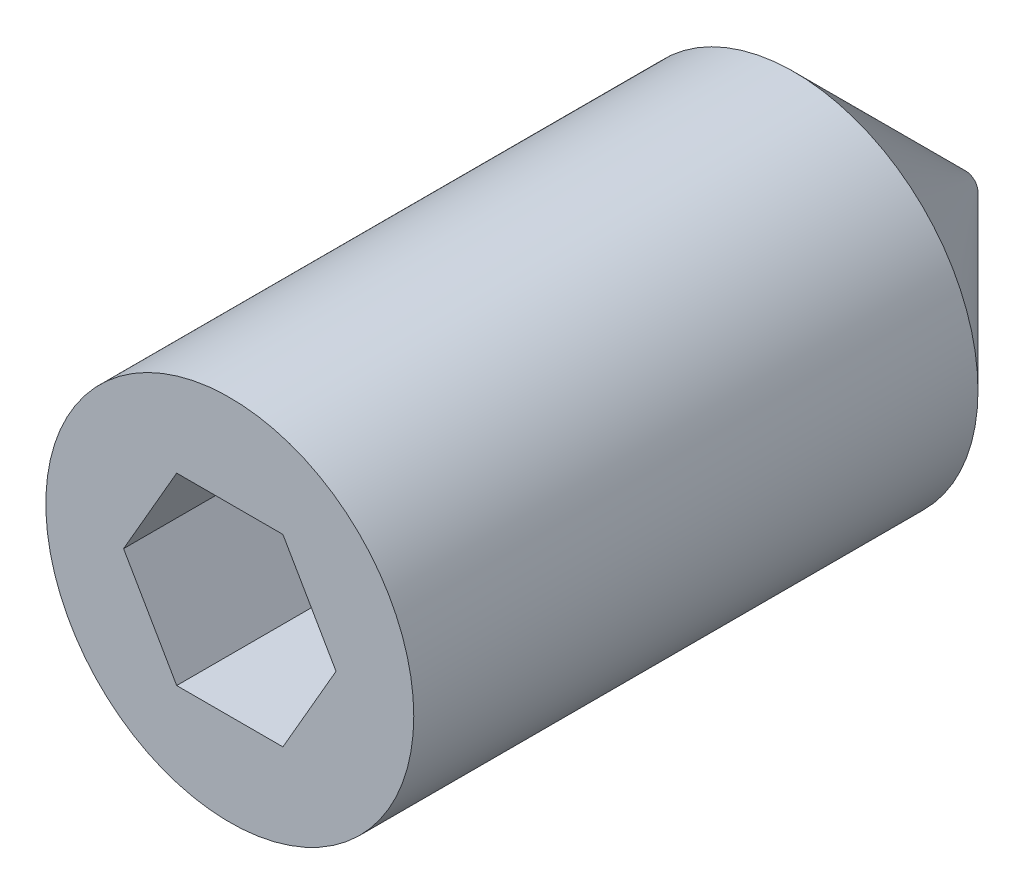
ISO-10303-21;
HEADER;
FILE_DESCRIPTION(('STEP AP214'),'2;1');
FILE_NAME('part.step','',(''),(''),'','','');
FILE_SCHEMA(('AUTOMOTIVE_DESIGN { 1 0 10303 214 1 1 1 1 }'));
ENDSEC;
DATA;
#1=APPLICATION_CONTEXT('core data for automotive mechanical design processes');
#2=APPLICATION_PROTOCOL_DEFINITION('international standard','automotive_design',2000,#1);
#3=PRODUCT_CONTEXT('',#1,'mechanical');
#4=PRODUCT('Part','Part','',(#3));
#5=PRODUCT_RELATED_PRODUCT_CATEGORY('part','',(#4));
#6=PRODUCT_DEFINITION_FORMATION('','',#4);
#7=PRODUCT_DEFINITION_CONTEXT('part definition',#1,'design');
#8=PRODUCT_DEFINITION('design','',#6,#7);
#9=PRODUCT_DEFINITION_SHAPE('','',#8);
#10=(LENGTH_UNIT() NAMED_UNIT(*) SI_UNIT(.MILLI.,.METRE.));
#11=(NAMED_UNIT(*) PLANE_ANGLE_UNIT() SI_UNIT($,.RADIAN.));
#12=(NAMED_UNIT(*) SI_UNIT($,.STERADIAN.) SOLID_ANGLE_UNIT());
#13=UNCERTAINTY_MEASURE_WITH_UNIT(LENGTH_MEASURE(1.E-05),#10,'distance_accuracy_value','');
#14=(GEOMETRIC_REPRESENTATION_CONTEXT(3) GLOBAL_UNCERTAINTY_ASSIGNED_CONTEXT((#13)) GLOBAL_UNIT_ASSIGNED_CONTEXT((#10,
#11,#12)) REPRESENTATION_CONTEXT('',''));
#15=CARTESIAN_POINT('',(0.,0.,0.));
#16=DIRECTION('',(0.,0.,1.));
#17=DIRECTION('',(1.,0.,0.));
#18=AXIS2_PLACEMENT_3D('',#15,#16,#17);
#19=CARTESIAN_POINT('',(0.,0.,-6.));
#20=DIRECTION('',(0.,0.,1.));
#21=DIRECTION('',(1.,0.,0.));
#22=AXIS2_PLACEMENT_3D('',#19,#20,#21);
#23=CYLINDRICAL_SURFACE('',#22,1.5);
#24=CARTESIAN_POINT('',(0.,0.,0.));
#25=DIRECTION('',(0.,0.,1.));
#26=DIRECTION('',(1.,0.,0.));
#27=AXIS2_PLACEMENT_3D('',#24,#25,#26);
#28=CIRCLE('',#27,1.5);
#29=CARTESIAN_POINT('',(1.5,0.,0.));
#30=VERTEX_POINT('',#29);
#31=EDGE_CURVE('E11',#30,#30,#28,.T.);
#32=ORIENTED_EDGE('',*,*,#31,.F.);
#33=EDGE_LOOP('',(#32));
#34=FACE_BOUND('',#33,.T.);
#35=CARTESIAN_POINT('',(0.,0.,-4.60000000000001));
#36=DIRECTION('',(0.,0.,1.));
#37=DIRECTION('',(1.,0.,0.));
#38=AXIS2_PLACEMENT_3D('',#35,#36,#37);
#39=CIRCLE('',#38,1.5);
#40=CARTESIAN_POINT('',(1.5,0.,-4.60000000000001));
#41=VERTEX_POINT('',#40);
#42=EDGE_CURVE('E124',#41,#41,#39,.T.);
#43=ORIENTED_EDGE('',*,*,#42,.T.);
#44=EDGE_LOOP('',(#43));
#45=FACE_BOUND('',#44,.T.);
#46=ADVANCED_FACE('F36',(#34,#45),#23,.T.);
#47=CARTESIAN_POINT('',(0.,0.,0.));
#48=DIRECTION('',(0.,0.,1.));
#49=DIRECTION('',(1.,0.,0.));
#50=AXIS2_PLACEMENT_3D('',#47,#48,#49);
#51=PLANE('',#50);
#52=DIRECTION('',(0.499999999999999,0.866025403784439,0.));
#53=VECTOR('',#52,1.);
#54=CARTESIAN_POINT('',(0.43301270189222,-0.75,0.));
#55=LINE('',#54,#53);
#56=CARTESIAN_POINT('',(0.43301270189222,-0.75,0.));
#57=VERTEX_POINT('',#56);
#58=CARTESIAN_POINT('',(0.866025403784439,0.,0.));
#59=VERTEX_POINT('',#58);
#60=EDGE_CURVE('E50',#57,#59,#55,.T.);
#61=ORIENTED_EDGE('',*,*,#60,.F.);
#62=DIRECTION('',(1.,0.,0.));
#63=VECTOR('',#62,1.);
#64=CARTESIAN_POINT('',(-0.433012701892219,-0.75,0.));
#65=LINE('',#64,#63);
#66=CARTESIAN_POINT('',(-0.433012701892219,-0.75,0.));
#67=VERTEX_POINT('',#66);
#68=EDGE_CURVE('E133',#67,#57,#65,.T.);
#69=ORIENTED_EDGE('',*,*,#68,.F.);
#70=DIRECTION('',(0.5,-0.866025403784439,0.));
#71=VECTOR('',#70,1.);
#72=CARTESIAN_POINT('',(-0.866025403784439,0.,0.));
#73=LINE('',#72,#71);
#74=CARTESIAN_POINT('',(-0.866025403784439,0.,0.));
#75=VERTEX_POINT('',#74);
#76=EDGE_CURVE('E131',#75,#67,#73,.T.);
#77=ORIENTED_EDGE('',*,*,#76,.F.);
#78=DIRECTION('',(-0.499999999999999,-0.866025403784439,0.));
#79=VECTOR('',#78,1.);
#80=CARTESIAN_POINT('',(-0.43301270189222,0.75,0.));
#81=LINE('',#80,#79);
#82=CARTESIAN_POINT('',(-0.43301270189222,0.75,0.));
#83=VERTEX_POINT('',#82);
#84=EDGE_CURVE('E97',#83,#75,#81,.T.);
#85=ORIENTED_EDGE('',*,*,#84,.F.);
#86=DIRECTION('',(-1.,0.,0.));
#87=VECTOR('',#86,1.);
#88=CARTESIAN_POINT('',(0.433012701892219,0.75,0.));
#89=LINE('',#88,#87);
#90=CARTESIAN_POINT('',(0.433012701892219,0.75,0.));
#91=VERTEX_POINT('',#90);
#92=EDGE_CURVE('E127',#91,#83,#89,.T.);
#93=ORIENTED_EDGE('',*,*,#92,.F.);
#94=DIRECTION('',(-0.5,0.866025403784438,0.));
#95=VECTOR('',#94,1.);
#96=CARTESIAN_POINT('',(0.866025403784438,0.,0.));
#97=LINE('',#96,#95);
#98=EDGE_CURVE('E123',#59,#91,#97,.T.);
#99=ORIENTED_EDGE('',*,*,#98,.F.);
#100=EDGE_LOOP('',(#61,#69,#77,#85,#93,#99));
#101=FACE_BOUND('',#100,.T.);
#102=ORIENTED_EDGE('',*,*,#31,.T.);
#103=EDGE_LOOP('',(#102));
#104=FACE_BOUND('',#103,.T.);
#105=ADVANCED_FACE('F145',(#101,#104),#51,.T.);
#106=CARTESIAN_POINT('',(0.43301270189222,-0.75,-1.2));
#107=DIRECTION('',(0.866025403784439,-0.499999999999999,0.));
#108=DIRECTION('',(0.5,0.866025403784439,0.));
#109=AXIS2_PLACEMENT_3D('',#106,#107,#108);
#110=PLANE('',#109);
#111=ORIENTED_EDGE('',*,*,#60,.T.);
#112=DIRECTION('',(0.,0.,1.));
#113=VECTOR('',#112,1.);
#114=CARTESIAN_POINT('',(0.866025403784438,0.,-1.2));
#115=LINE('',#114,#113);
#116=CARTESIAN_POINT('',(0.866025403784438,0.,-1.2));
#117=VERTEX_POINT('',#116);
#118=EDGE_CURVE('E79',#117,#59,#115,.T.);
#119=ORIENTED_EDGE('',*,*,#118,.F.);
#120=DIRECTION('',(0.499999999999999,0.866025403784439,0.));
#121=VECTOR('',#120,1.);
#122=CARTESIAN_POINT('',(0.43301270189222,-0.75,-1.2));
#123=LINE('',#122,#121);
#124=CARTESIAN_POINT('',(0.43301270189222,-0.75,-1.2));
#125=VERTEX_POINT('',#124);
#126=EDGE_CURVE('E135',#125,#117,#123,.T.);
#127=ORIENTED_EDGE('',*,*,#126,.F.);
#128=DIRECTION('',(0.,0.,1.));
#129=VECTOR('',#128,1.);
#130=CARTESIAN_POINT('',(0.43301270189222,-0.75,-1.2));
#131=LINE('',#130,#129);
#132=EDGE_CURVE('E43',#125,#57,#131,.T.);
#133=ORIENTED_EDGE('',*,*,#132,.T.);
#134=EDGE_LOOP('',(#111,#119,#127,#133));
#135=FACE_BOUND('',#134,.T.);
#136=ADVANCED_FACE('F174',(#135),#110,.F.);
#137=CARTESIAN_POINT('',(-0.433012701892219,-0.75,-1.2));
#138=DIRECTION('',(0.,-1.,0.));
#139=DIRECTION('',(1.,0.,0.));
#140=AXIS2_PLACEMENT_3D('',#137,#138,#139);
#141=PLANE('',#140);
#142=ORIENTED_EDGE('',*,*,#68,.T.);
#143=ORIENTED_EDGE('',*,*,#132,.F.);
#144=DIRECTION('',(1.,0.,0.));
#145=VECTOR('',#144,1.);
#146=CARTESIAN_POINT('',(-0.433012701892219,-0.75,-1.2));
#147=LINE('',#146,#145);
#148=CARTESIAN_POINT('',(-0.433012701892219,-0.75,-1.2));
#149=VERTEX_POINT('',#148);
#150=EDGE_CURVE('E109',#149,#125,#147,.T.);
#151=ORIENTED_EDGE('',*,*,#150,.F.);
#152=DIRECTION('',(0.,0.,1.));
#153=VECTOR('',#152,1.);
#154=CARTESIAN_POINT('',(-0.433012701892219,-0.75,-1.2));
#155=LINE('',#154,#153);
#156=EDGE_CURVE('E101',#149,#67,#155,.T.);
#157=ORIENTED_EDGE('',*,*,#156,.T.);
#158=EDGE_LOOP('',(#142,#143,#151,#157));
#159=FACE_BOUND('',#158,.T.);
#160=ADVANCED_FACE('F181',(#159),#141,.F.);
#161=CARTESIAN_POINT('',(-0.866025403784439,0.,-1.2));
#162=DIRECTION('',(-0.866025403784439,-0.5,0.));
#163=DIRECTION('',(0.5,-0.866025403784439,0.));
#164=AXIS2_PLACEMENT_3D('',#161,#162,#163);
#165=PLANE('',#164);
#166=ORIENTED_EDGE('',*,*,#76,.T.);
#167=ORIENTED_EDGE('',*,*,#156,.F.);
#168=DIRECTION('',(0.5,-0.866025403784439,0.));
#169=VECTOR('',#168,1.);
#170=CARTESIAN_POINT('',(-0.866025403784439,0.,-1.2));
#171=LINE('',#170,#169);
#172=CARTESIAN_POINT('',(-0.866025403784439,0.,-1.2));
#173=VERTEX_POINT('',#172);
#174=EDGE_CURVE('E105',#173,#149,#171,.T.);
#175=ORIENTED_EDGE('',*,*,#174,.F.);
#176=DIRECTION('',(0.,0.,1.));
#177=VECTOR('',#176,1.);
#178=CARTESIAN_POINT('',(-0.866025403784439,0.,-1.2));
#179=LINE('',#178,#177);
#180=EDGE_CURVE('E90',#173,#75,#179,.T.);
#181=ORIENTED_EDGE('',*,*,#180,.T.);
#182=EDGE_LOOP('',(#166,#167,#175,#181));
#183=FACE_BOUND('',#182,.T.);
#184=ADVANCED_FACE('F106',(#183),#165,.F.);
#185=CARTESIAN_POINT('',(-0.43301270189222,0.75,-1.2));
#186=DIRECTION('',(-0.866025403784439,0.5,0.));
#187=DIRECTION('',(-0.5,-0.866025403784439,0.));
#188=AXIS2_PLACEMENT_3D('',#185,#186,#187);
#189=PLANE('',#188);
#190=ORIENTED_EDGE('',*,*,#84,.T.);
#191=ORIENTED_EDGE('',*,*,#180,.F.);
#192=DIRECTION('',(-0.499999999999999,-0.866025403784439,0.));
#193=VECTOR('',#192,1.);
#194=CARTESIAN_POINT('',(-0.43301270189222,0.75,-1.2));
#195=LINE('',#194,#193);
#196=CARTESIAN_POINT('',(-0.43301270189222,0.75,-1.2));
#197=VERTEX_POINT('',#196);
#198=EDGE_CURVE('E94',#197,#173,#195,.T.);
#199=ORIENTED_EDGE('',*,*,#198,.F.);
#200=DIRECTION('',(0.,0.,1.));
#201=VECTOR('',#200,1.);
#202=CARTESIAN_POINT('',(-0.43301270189222,0.75,-1.2));
#203=LINE('',#202,#201);
#204=EDGE_CURVE('E102',#197,#83,#203,.T.);
#205=ORIENTED_EDGE('',*,*,#204,.T.);
#206=EDGE_LOOP('',(#190,#191,#199,#205));
#207=FACE_BOUND('',#206,.T.);
#208=ADVANCED_FACE('F92',(#207),#189,.F.);
#209=CARTESIAN_POINT('',(0.433012701892219,0.75,-1.2));
#210=DIRECTION('',(0.,1.,0.));
#211=DIRECTION('',(0.,0.,1.));
#212=AXIS2_PLACEMENT_3D('',#209,#210,#211);
#213=PLANE('',#212);
#214=ORIENTED_EDGE('',*,*,#92,.T.);
#215=ORIENTED_EDGE('',*,*,#204,.F.);
#216=DIRECTION('',(-1.,0.,0.));
#217=VECTOR('',#216,1.);
#218=CARTESIAN_POINT('',(0.433012701892219,0.75,-1.2));
#219=LINE('',#218,#217);
#220=CARTESIAN_POINT('',(0.433012701892219,0.75,-1.2));
#221=VERTEX_POINT('',#220);
#222=EDGE_CURVE('E115',#221,#197,#219,.T.);
#223=ORIENTED_EDGE('',*,*,#222,.F.);
#224=DIRECTION('',(0.,0.,1.));
#225=VECTOR('',#224,1.);
#226=CARTESIAN_POINT('',(0.433012701892219,0.75,-1.2));
#227=LINE('',#226,#225);
#228=EDGE_CURVE('E139',#221,#91,#227,.T.);
#229=ORIENTED_EDGE('',*,*,#228,.T.);
#230=EDGE_LOOP('',(#214,#215,#223,#229));
#231=FACE_BOUND('',#230,.T.);
#232=ADVANCED_FACE('F149',(#231),#213,.F.);
#233=CARTESIAN_POINT('',(0.866025403784438,0.,-1.2));
#234=DIRECTION('',(0.866025403784439,0.5,0.));
#235=DIRECTION('',(-0.5,0.866025403784439,0.));
#236=AXIS2_PLACEMENT_3D('',#233,#234,#235);
#237=PLANE('',#236);
#238=ORIENTED_EDGE('',*,*,#98,.T.);
#239=ORIENTED_EDGE('',*,*,#228,.F.);
#240=DIRECTION('',(-0.5,0.866025403784438,0.));
#241=VECTOR('',#240,1.);
#242=CARTESIAN_POINT('',(0.866025403784438,0.,-1.2));
#243=LINE('',#242,#241);
#244=EDGE_CURVE('E117',#117,#221,#243,.T.);
#245=ORIENTED_EDGE('',*,*,#244,.F.);
#246=ORIENTED_EDGE('',*,*,#118,.T.);
#247=EDGE_LOOP('',(#238,#239,#245,#246));
#248=FACE_BOUND('',#247,.T.);
#249=ADVANCED_FACE('F142',(#248),#237,.F.);
#250=CARTESIAN_POINT('',(0.,0.,-1.2));
#251=DIRECTION('',(0.,0.,1.));
#252=DIRECTION('',(1.,0.,0.));
#253=AXIS2_PLACEMENT_3D('',#250,#251,#252);
#254=PLANE('',#253);
#255=ORIENTED_EDGE('',*,*,#126,.T.);
#256=ORIENTED_EDGE('',*,*,#244,.T.);
#257=ORIENTED_EDGE('',*,*,#222,.T.);
#258=ORIENTED_EDGE('',*,*,#198,.T.);
#259=ORIENTED_EDGE('',*,*,#174,.T.);
#260=ORIENTED_EDGE('',*,*,#150,.T.);
#261=EDGE_LOOP('',(#255,#256,#257,#258,#259,#260));
#262=FACE_BOUND('',#261,.T.);
#263=ADVANCED_FACE('F112',(#262),#254,.T.);
#264=CARTESIAN_POINT('',(0.,0.,-4.60000000000001));
#265=DIRECTION('',(0.,0.,1.));
#266=DIRECTION('',(1.,0.,0.));
#267=AXIS2_PLACEMENT_3D('',#264,#265,#266);
#268=CONICAL_SURFACE('',#267,1.5,0.785398163397453);
#269=CARTESIAN_POINT('',(0.,0.,-6.));
#270=DIRECTION('',(0.,0.,1.));
#271=DIRECTION('',(1.,0.,0.));
#272=AXIS2_PLACEMENT_3D('',#269,#270,#271);
#273=CIRCLE('',#272,0.1);
#274=CARTESIAN_POINT('',(0.0999999999999996,0.,-6.));
#275=VERTEX_POINT('',#274);
#276=EDGE_CURVE('E154',#275,#275,#273,.T.);
#277=CARTESIAN_POINT('',(0.0999999999999996,0.,-6.));
#278=CARTESIAN_POINT('',(0.114583333333333,0.,-5.98541666666667));
#279=CARTESIAN_POINT('',(0.129166666666667,0.,-5.97083333333333));
#280=CARTESIAN_POINT('',(0.158333333333333,0.,-5.94166666666667));
#281=CARTESIAN_POINT('',(0.172916666666666,0.,-5.92708333333333));
#282=CARTESIAN_POINT('',(0.202083333333333,0.,-5.89791666666667));
#283=CARTESIAN_POINT('',(0.216666666666666,0.,-5.88333333333333));
#284=CARTESIAN_POINT('',(0.245833333333333,0.,-5.85416666666667));
#285=CARTESIAN_POINT('',(0.260416666666666,0.,-5.83958333333334));
#286=CARTESIAN_POINT('',(0.289583333333333,0.,-5.81041666666667));
#287=CARTESIAN_POINT('',(0.304166666666666,0.,-5.79583333333334));
#288=CARTESIAN_POINT('',(0.333333333333333,0.,-5.76666666666667));
#289=CARTESIAN_POINT('',(0.347916666666666,0.,-5.75208333333334));
#290=CARTESIAN_POINT('',(0.377083333333333,0.,-5.72291666666667));
#291=CARTESIAN_POINT('',(0.391666666666666,0.,-5.70833333333334));
#292=CARTESIAN_POINT('',(0.420833333333333,0.,-5.67916666666667));
#293=CARTESIAN_POINT('',(0.435416666666666,0.,-5.66458333333334));
#294=CARTESIAN_POINT('',(0.464583333333333,0.,-5.63541666666667));
#295=CARTESIAN_POINT('',(0.479166666666666,0.,-5.62083333333334));
#296=CARTESIAN_POINT('',(0.508333333333333,0.,-5.59166666666667));
#297=CARTESIAN_POINT('',(0.522916666666666,0.,-5.57708333333334));
#298=CARTESIAN_POINT('',(0.552083333333333,0.,-5.54791666666667));
#299=CARTESIAN_POINT('',(0.566666666666666,0.,-5.53333333333334));
#300=CARTESIAN_POINT('',(0.595833333333333,0.,-5.50416666666667));
#301=CARTESIAN_POINT('',(0.610416666666666,0.,-5.48958333333334));
#302=CARTESIAN_POINT('',(0.639583333333333,0.,-5.46041666666667));
#303=CARTESIAN_POINT('',(0.654166666666666,0.,-5.44583333333334));
#304=CARTESIAN_POINT('',(0.683333333333333,0.,-5.41666666666667));
#305=CARTESIAN_POINT('',(0.697916666666666,0.,-5.40208333333334));
#306=CARTESIAN_POINT('',(0.727083333333333,0.,-5.37291666666667));
#307=CARTESIAN_POINT('',(0.741666666666666,0.,-5.35833333333334));
#308=CARTESIAN_POINT('',(0.770833333333333,0.,-5.32916666666667));
#309=CARTESIAN_POINT('',(0.785416666666666,0.,-5.31458333333334));
#310=CARTESIAN_POINT('',(0.814583333333333,0.,-5.28541666666667));
#311=CARTESIAN_POINT('',(0.829166666666666,0.,-5.27083333333334));
#312=CARTESIAN_POINT('',(0.858333333333333,0.,-5.24166666666668));
#313=CARTESIAN_POINT('',(0.872916666666666,0.,-5.22708333333334));
#314=CARTESIAN_POINT('',(0.902083333333333,0.,-5.19791666666667));
#315=CARTESIAN_POINT('',(0.916666666666666,0.,-5.18333333333334));
#316=CARTESIAN_POINT('',(0.945833333333333,0.,-5.15416666666668));
#317=CARTESIAN_POINT('',(0.960416666666666,0.,-5.13958333333334));
#318=CARTESIAN_POINT('',(0.989583333333333,0.,-5.11041666666668));
#319=CARTESIAN_POINT('',(1.00416666666667,0.,-5.09583333333334));
#320=CARTESIAN_POINT('',(1.03333333333333,0.,-5.06666666666668));
#321=CARTESIAN_POINT('',(1.04791666666667,0.,-5.05208333333334));
#322=CARTESIAN_POINT('',(1.07708333333333,0.,-5.02291666666668));
#323=CARTESIAN_POINT('',(1.09166666666667,0.,-5.00833333333334));
#324=CARTESIAN_POINT('',(1.12083333333333,0.,-4.97916666666668));
#325=CARTESIAN_POINT('',(1.13541666666667,0.,-4.96458333333335));
#326=CARTESIAN_POINT('',(1.16458333333333,0.,-4.93541666666668));
#327=CARTESIAN_POINT('',(1.17916666666667,0.,-4.92083333333335));
#328=CARTESIAN_POINT('',(1.20833333333333,0.,-4.89166666666668));
#329=CARTESIAN_POINT('',(1.22291666666667,0.,-4.87708333333335));
#330=CARTESIAN_POINT('',(1.25208333333333,0.,-4.84791666666668));
#331=CARTESIAN_POINT('',(1.26666666666667,0.,-4.83333333333335));
#332=CARTESIAN_POINT('',(1.29583333333333,0.,-4.80416666666668));
#333=CARTESIAN_POINT('',(1.31041666666667,0.,-4.78958333333335));
#334=CARTESIAN_POINT('',(1.33958333333333,0.,-4.76041666666668));
#335=CARTESIAN_POINT('',(1.35416666666667,0.,-4.74583333333335));
#336=CARTESIAN_POINT('',(1.38333333333333,0.,-4.71666666666668));
#337=CARTESIAN_POINT('',(1.39791666666667,0.,-4.70208333333335));
#338=CARTESIAN_POINT('',(1.42708333333333,0.,-4.67291666666668));
#339=CARTESIAN_POINT('',(1.44166666666667,0.,-4.65833333333335));
#340=CARTESIAN_POINT('',(1.47083333333333,0.,-4.62916666666668));
#341=CARTESIAN_POINT('',(1.48541666666667,0.,-4.61458333333335));
#342=CARTESIAN_POINT('',(1.5,0.,-4.60000000000002));
#343=B_SPLINE_CURVE_WITH_KNOTS('',3,(#277,#278,#279,#280,#281,#282,#283,#284,#285,#286,#287,
#288,#289,#290,#291,#292,#293,#294,#295,#296,#297,#298,#299,#300,#301,#302,#303,#304,#305,#306,
#307,#308,#309,#310,#311,#312,#313,#314,#315,#316,#317,#318,#319,#320,#321,#322,#323,#324,#325,
#326,#327,#328,#329,#330,#331,#332,#333,#334,#335,#336,#337,#338,#339,#340,#341,#342),
.UNSPECIFIED.,.F.,.F.,(4,2,2,2,2,2,2,2,2,2,2,2,2,2,2,2,2,2,2,2,2,2,2,2,2,2,2,2,2,2,2,2,4),(0.,
0.0618718433538219,0.123743686707645,0.185615530061467,0.24748737341529,0.309359216769113,
0.371231060122935,0.433102903476758,0.49497474683058,0.556846590184403,0.618718433538226,
0.680590276892048,0.742462120245871,0.804333963599693,0.866205806953516,0.928077650307339,
0.989949493661161,1.05182133701498,1.11369318036881,1.17556502372263,1.23743686707645,
1.29930871043027,1.3611805537841,1.42305239713792,1.48492424049174,1.54679608384556,
1.60866792719939,1.67053977055321,1.73241161390703,1.79428345726086,1.85615530061468,
1.9180271439685,1.97989898732232),.UNSPECIFIED.);
#344=EDGE_CURVE('BSEAM158',#275,#41,#343,.T.);
#345=ORIENTED_EDGE('',*,*,#276,.T.);
#346=ORIENTED_EDGE('',*,*,#42,.F.);
#347=ORIENTED_EDGE('',*,*,#344,.T.);
#348=ORIENTED_EDGE('',*,*,#344,.F.);
#349=EDGE_LOOP('',(#345,#347,#346,#348));
#350=FACE_BOUND('',#349,.T.);
#351=ADVANCED_FACE('F158',(#350),#268,.T.);
#352=CARTESIAN_POINT('',(0.,0.,-6.));
#353=DIRECTION('',(0.,0.,1.));
#354=DIRECTION('',(1.,0.,0.));
#355=AXIS2_PLACEMENT_3D('',#352,#353,#354);
#356=PLANE('',#355);
#357=ORIENTED_EDGE('',*,*,#276,.F.);
#358=EDGE_LOOP('',(#357));
#359=FACE_BOUND('',#358,.T.);
#360=ADVANCED_FACE('F161',(#359),#356,.F.);
#361=CLOSED_SHELL('',(#46,#105,#136,#160,#184,#208,#232,#249,#263,#351,#360));
#362=MANIFOLD_SOLID_BREP('B2',#361);
#363=ADVANCED_BREP_SHAPE_REPRESENTATION('',(#18,#362),#14);
#364=SHAPE_DEFINITION_REPRESENTATION(#9,#363);
ENDSEC;
END-ISO-10303-21;
